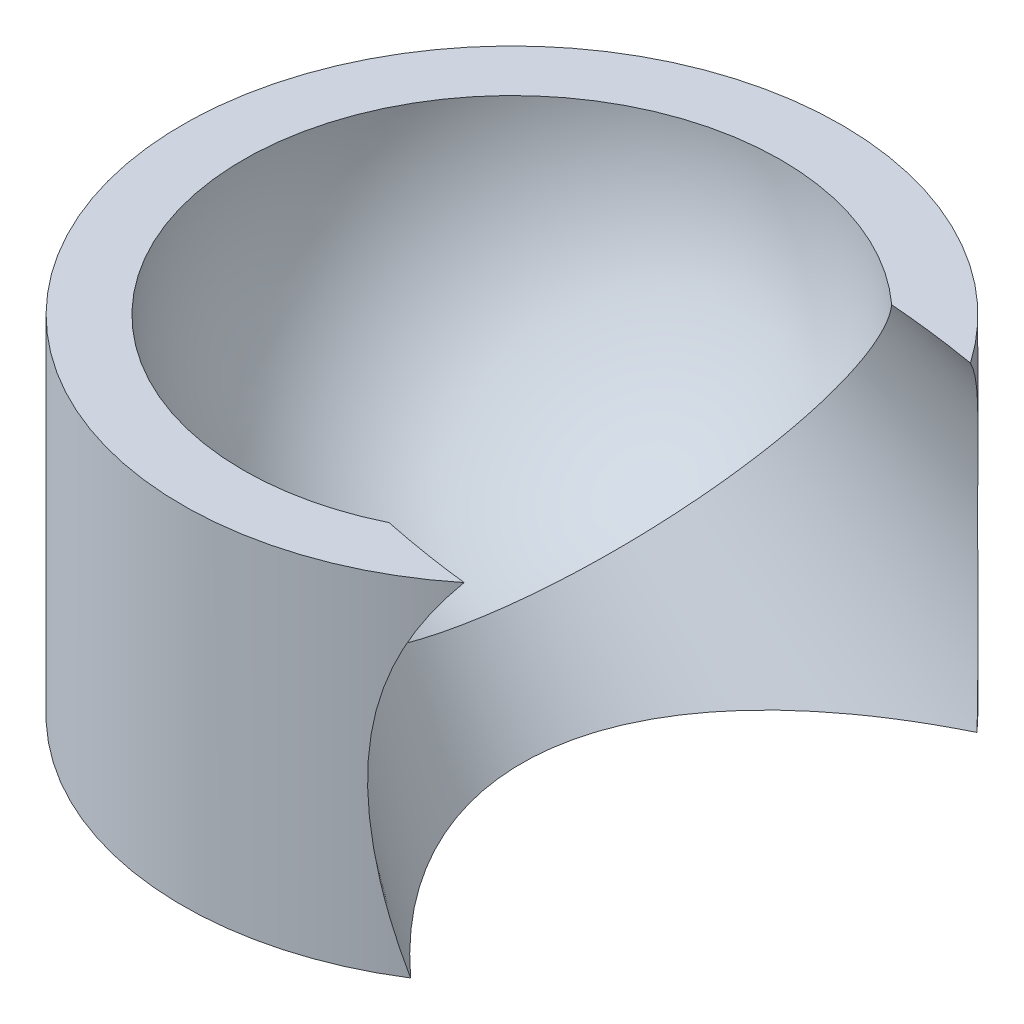
ISO-10303-21;
HEADER;
FILE_DESCRIPTION(('STEP AP214'),'2;1');
FILE_NAME('part.step','',(''),(''),'','','');
FILE_SCHEMA(('AUTOMOTIVE_DESIGN { 1 0 10303 214 1 1 1 1 }'));
ENDSEC;
DATA;
#1=APPLICATION_CONTEXT('core data for automotive mechanical design processes');
#2=APPLICATION_PROTOCOL_DEFINITION('international standard','automotive_design',2000,#1);
#3=PRODUCT_CONTEXT('',#1,'mechanical');
#4=PRODUCT('Part','Part','',(#3));
#5=PRODUCT_RELATED_PRODUCT_CATEGORY('part','',(#4));
#6=PRODUCT_DEFINITION_FORMATION('','',#4);
#7=PRODUCT_DEFINITION_CONTEXT('part definition',#1,'design');
#8=PRODUCT_DEFINITION('design','',#6,#7);
#9=PRODUCT_DEFINITION_SHAPE('','',#8);
#10=(LENGTH_UNIT() NAMED_UNIT(*) SI_UNIT(.MILLI.,.METRE.));
#11=(NAMED_UNIT(*) PLANE_ANGLE_UNIT() SI_UNIT($,.RADIAN.));
#12=(NAMED_UNIT(*) SI_UNIT($,.STERADIAN.) SOLID_ANGLE_UNIT());
#13=UNCERTAINTY_MEASURE_WITH_UNIT(LENGTH_MEASURE(1.E-05),#10,'distance_accuracy_value','');
#14=(GEOMETRIC_REPRESENTATION_CONTEXT(3) GLOBAL_UNCERTAINTY_ASSIGNED_CONTEXT((#13)) GLOBAL_UNIT_ASSIGNED_CONTEXT((#10,
#11,#12)) REPRESENTATION_CONTEXT('',''));
#15=CARTESIAN_POINT('',(0.,0.,0.));
#16=DIRECTION('',(0.,0.,1.));
#17=DIRECTION('',(1.,0.,0.));
#18=AXIS2_PLACEMENT_3D('',#15,#16,#17);
#19=CARTESIAN_POINT('',(-82.2724133595217,97.7,-15.));
#20=DIRECTION('',(0.,-1.,0.));
#21=DIRECTION('',(0.,0.,1.));
#22=AXIS2_PLACEMENT_3D('',#19,#20,#21);
#23=CYLINDRICAL_SURFACE('',#22,3.8);
#24=CARTESIAN_POINT('',(-82.2724133595217,97.,-15.));
#25=DIRECTION('',(0.,-1.,0.));
#26=DIRECTION('',(0.,0.,-1.));
#27=AXIS2_PLACEMENT_3D('',#24,#25,#26);
#28=CIRCLE('',#27,3.8);
#29=CARTESIAN_POINT('',(-80.2346484142775,97.,-11.7925845252081));
#30=VERTEX_POINT('',#29);
#31=CARTESIAN_POINT('',(-79.4208360761548,97.,-17.5116741422777));
#32=VERTEX_POINT('',#31);
#33=EDGE_CURVE('E47',#30,#32,#28,.T.);
#34=ORIENTED_EDGE('',*,*,#33,.F.);
#35=CARTESIAN_POINT('',(-79.8757515721661,101.0002,-12.0510998190801));
#36=CARTESIAN_POINT('',(-79.9187324942041,100.941314470494,-12.0161596661977));
#37=CARTESIAN_POINT('',(-79.9607737867758,100.880334472737,-11.9835604754787));
#38=CARTESIAN_POINT('',(-80.0421203511133,100.754374278326,-11.9229308128146));
#39=CARTESIAN_POINT('',(-80.0814246426146,100.689392664025,-11.8949019729807));
#40=CARTESIAN_POINT('',(-80.1561944542201,100.556042110918,-11.8434718400634));
#41=CARTESIAN_POINT('',(-80.1916806155117,100.487694636403,-11.8200450333706));
#42=CARTESIAN_POINT('',(-80.2582872747055,100.347645833791,-11.7774452092828));
#43=CARTESIAN_POINT('',(-80.2894086838969,100.275945209957,-11.7582713034635));
#44=CARTESIAN_POINT('',(-80.3467645054102,100.129422236479,-11.723874171494));
#45=CARTESIAN_POINT('',(-80.3729830658612,100.054590686642,-11.708663699603));
#46=CARTESIAN_POINT('',(-80.420020103535,99.9025749564758,-11.6819626490187));
#47=CARTESIAN_POINT('',(-80.4408364300622,99.8253898527917,-11.6704735513997));
#48=CARTESIAN_POINT('',(-80.4769106153219,99.6693551529714,-11.6508818974913));
#49=CARTESIAN_POINT('',(-80.4921709705092,99.5905063212864,-11.642777819975));
#50=CARTESIAN_POINT('',(-80.5172652372034,99.4316928256814,-11.629591546817));
#51=CARTESIAN_POINT('',(-80.5270975251341,99.3517278352348,-11.6245102552784));
#52=CARTESIAN_POINT('',(-80.5447869030997,99.1563821489884,-11.6154089956451));
#53=CARTESIAN_POINT('',(-80.5499364918525,99.0406874090679,-11.6128058459412));
#54=CARTESIAN_POINT('',(-80.551001814994,98.8092431130935,-11.6122673948075));
#55=CARTESIAN_POINT('',(-80.5469121531169,98.6934935645023,-11.6143348212687));
#56=CARTESIAN_POINT('',(-80.5309163732629,98.4621048722978,-11.6225354664216));
#57=CARTESIAN_POINT('',(-80.5189696358879,98.3464694469416,-11.6286898152432));
#58=CARTESIAN_POINT('',(-80.4885971699469,98.1163673648676,-11.6446622588753));
#59=CARTESIAN_POINT('',(-80.4701728966108,98.001900451573,-11.6544795308113));
#60=CARTESIAN_POINT('',(-80.4210621704128,97.7367003729433,-11.6813378193191));
#61=CARTESIAN_POINT('',(-80.3883355698651,97.5864778116716,-11.6996938161132));
#62=CARTESIAN_POINT('',(-80.3340717268447,97.3639688517672,-11.7314735876289));
#63=CARTESIAN_POINT('',(-80.3152421185966,97.2906762454686,-11.7426993300624));
#64=CARTESIAN_POINT('',(-80.2760307382489,97.14474722216,-11.7665833087369));
#65=CARTESIAN_POINT('',(-80.2556490695164,97.0721107618106,-11.7792414496075));
#66=CARTESIAN_POINT('',(-80.234590161155,96.9998,-11.7926215358648));
#67=B_SPLINE_CURVE_WITH_KNOTS('',3,(#35,#36,#37,#38,#39,#40,#41,#42,#43,#44,#45,#46,#47,#48,#49,
#50,#51,#52,#53,#54,#55,#56,#57,#58,#59,#60,#61,#62,#63,#64,#65,#66),.UNSPECIFIED.,.F.,.F.,(4,2,
2,2,2,2,2,2,2,2,2,2,2,2,2,4),(0.,0.242487812446085,0.485062030598379,0.726250914982063,
0.967389367841493,1.20929447541562,1.45129574114893,1.69318813428322,1.93515284012404,
2.28209096716265,2.62923177885385,2.97818149210642,3.32705286107755,3.79116730720974,
4.020646080706,4.25010958426819),.UNSPECIFIED.);
#68=CARTESIAN_POINT('',(-79.8758974920685,101.,-12.0509812314864));
#69=VERTEX_POINT('',#68);
#70=EDGE_CURVE('E100',#69,#30,#67,.T.);
#71=ORIENTED_EDGE('',*,*,#70,.F.);
#72=CARTESIAN_POINT('',(-82.2724133595217,101.,-15.));
#73=DIRECTION('',(0.,-1.,0.));
#74=DIRECTION('',(0.,0.,-1.));
#75=AXIS2_PLACEMENT_3D('',#72,#73,#74);
#76=CIRCLE('',#75,3.8);
#77=CARTESIAN_POINT('',(-79.1484041425032,101.,-17.1634616733336));
#78=VERTEX_POINT('',#77);
#79=EDGE_CURVE('E84',#69,#78,#76,.T.);
#80=ORIENTED_EDGE('',*,*,#79,.T.);
#81=CARTESIAN_POINT('',(-79.4207904593027,96.9998,-17.51162235118));
#82=CARTESIAN_POINT('',(-79.4369262194832,97.0705546747354,-17.529942716842));
#83=CARTESIAN_POINT('',(-79.4526325529312,97.1416227927385,-17.5474188700959));
#84=CARTESIAN_POINT('',(-79.4830068820868,97.2843968994103,-17.5806429487578));
#85=CARTESIAN_POINT('',(-79.4976746731815,97.3561030106608,-17.596390533939));
#86=CARTESIAN_POINT('',(-79.5399510327827,97.5727136817751,-17.641086102033));
#87=CARTESIAN_POINT('',(-79.5657040388626,97.7185595063866,-17.6673434890366));
#88=CARTESIAN_POINT('',(-79.6109327630899,98.0158920594204,-17.7124834219657));
#89=CARTESIAN_POINT('',(-79.6302505518494,98.1674313864205,-17.731182538714));
#90=CARTESIAN_POINT('',(-79.6592635940215,98.4721704684842,-17.7589622394461));
#91=CARTESIAN_POINT('',(-79.6689752628782,98.6253669371333,-17.7680592338353));
#92=CARTESIAN_POINT('',(-79.6744706398831,98.8659999089151,-17.7732094047869));
#93=CARTESIAN_POINT('',(-79.6744580705941,98.9532633070037,-17.7731991134858));
#94=CARTESIAN_POINT('',(-79.6699237880866,99.1275942839114,-17.768946072486));
#95=CARTESIAN_POINT('',(-79.6654019533468,99.2146618573899,-17.7647032087227));
#96=CARTESIAN_POINT('',(-79.6514849354616,99.3874862827804,-17.751513350895));
#97=CARTESIAN_POINT('',(-79.6421218637592,99.473247984399,-17.742597348031));
#98=CARTESIAN_POINT('',(-79.6183236497529,99.6433678720104,-17.7195739487868));
#99=CARTESIAN_POINT('',(-79.6038889305033,99.727726174454,-17.7054669854088));
#100=CARTESIAN_POINT('',(-79.5698058726259,99.8952399752276,-17.671422636116));
#101=CARTESIAN_POINT('',(-79.5500998326725,99.9783707074235,-17.6514204565739));
#102=CARTESIAN_POINT('',(-79.5059406509832,100.141642311545,-17.6053110062388));
#103=CARTESIAN_POINT('',(-79.4814868573308,100.22178277107,-17.5792028969366));
#104=CARTESIAN_POINT('',(-79.4285226937757,100.378437216735,-17.5206829331851));
#105=CARTESIAN_POINT('',(-79.4000080208012,100.454947239775,-17.4882643783919));
#106=CARTESIAN_POINT('',(-79.3399114430989,100.603678553575,-17.4171460803157));
#107=CARTESIAN_POINT('',(-79.3083309961023,100.675901856538,-17.3784493164117));
#108=CARTESIAN_POINT('',(-79.2550966273551,100.790159616009,-17.3101794474463));
#109=CARTESIAN_POINT('',(-79.2340328268013,100.83358075225,-17.2824403200197));
#110=CARTESIAN_POINT('',(-79.1914504990428,100.918387540099,-17.2246248482954));
#111=CARTESIAN_POINT('',(-79.1699334919482,100.959778804244,-17.1945556201363));
#112=CARTESIAN_POINT('',(-79.1482970942916,101.0002,-17.1633070890017));
#113=B_SPLINE_CURVE_WITH_KNOTS('',3,(#81,#82,#83,#84,#85,#86,#87,#88,#89,#90,#91,#92,#93,#94,
#95,#96,#97,#98,#99,#100,#101,#102,#103,#104,#105,#106,#107,#108,#109,#110,#111,#112),
.UNSPECIFIED.,.F.,.F.,(4,2,2,2,2,2,2,2,2,2,2,2,2,2,2,4),(0.,0.224529608607498,0.449103331512397,
0.899999438098988,1.36126182999427,1.82173462355418,2.08334352968169,2.34495948616088,
2.60486201655752,2.86474287218569,3.1275939253799,3.39048109634728,3.65364893503415,
3.91669224847528,4.08360469898818,4.25002609611645),.UNSPECIFIED.);
#114=EDGE_CURVE('E78',#32,#78,#113,.T.);
#115=ORIENTED_EDGE('',*,*,#114,.F.);
#116=EDGE_LOOP('',(#34,#71,#80,#115));
#117=FACE_BOUND('',#116,.T.);
#118=ADVANCED_FACE('F41',(#117),#23,.T.);
#119=CARTESIAN_POINT('',(-82.2724133595217,97.,-15.));
#120=DIRECTION('',(0.,1.,0.));
#121=DIRECTION('',(0.,0.,-1.));
#122=AXIS2_PLACEMENT_3D('',#119,#120,#121);
#123=PLANE('',#122);
#124=ORIENTED_EDGE('',*,*,#33,.T.);
#125=CARTESIAN_POINT('',(-71.3162534697557,97.,-13.4409654868627));
#126=DIRECTION('',(0.,-1.,0.));
#127=DIRECTION('',(0.990026908932881,0.,0.140878385811327));
#128=AXIS2_PLACEMENT_3D('',#125,#126,#127);
#129=ELLIPSE('',#128,10.5033012386468,5.02786274995613);
#130=EDGE_CURVE('E62',#30,#32,#129,.T.);
#131=ORIENTED_EDGE('',*,*,#130,.F.);
#132=EDGE_LOOP('',(#124,#131));
#133=FACE_BOUND('',#132,.T.);
#134=ADVANCED_FACE('F108',(#133),#123,.F.);
#135=CARTESIAN_POINT('',(-82.2724133595217,101.,-15.));
#136=DIRECTION('',(0.,1.,0.));
#137=DIRECTION('',(0.,0.,-1.));
#138=AXIS2_PLACEMENT_3D('',#135,#136,#137);
#139=PLANE('',#138);
#140=CARTESIAN_POINT('',(-79.8256121020381,101.,-14.6518262196257));
#141=DIRECTION('',(0.,-1.,0.));
#142=DIRECTION('',(0.990026908932881,0.,0.140878385811327));
#143=AXIS2_PLACEMENT_3D('',#140,#141,#142);
#144=ELLIPSE('',#143,5.40311255334571,2.58643522865266);
#145=CARTESIAN_POINT('',(-80.9068417887553,101.,-12.2169774910873));
#146=VERTEX_POINT('',#145);
#147=EDGE_CURVE('E85',#69,#146,#144,.T.);
#148=ORIENTED_EDGE('',*,*,#147,.T.);
#149=CARTESIAN_POINT('',(-82.2724133595217,101.,-15.));
#150=DIRECTION('',(0.,-1.,0.));
#151=DIRECTION('',(0.,0.,-1.));
#152=AXIS2_PLACEMENT_3D('',#149,#150,#151);
#153=CIRCLE('',#152,3.1);
#154=CARTESIAN_POINT('',(-80.1847308375046,101.,-17.2916329739433));
#155=VERTEX_POINT('',#154);
#156=EDGE_CURVE('E74',#146,#155,#153,.T.);
#157=ORIENTED_EDGE('',*,*,#156,.T.);
#158=EDGE_CURVE('E77',#155,#78,#144,.T.);
#159=ORIENTED_EDGE('',*,*,#158,.T.);
#160=ORIENTED_EDGE('',*,*,#79,.F.);
#161=EDGE_LOOP('',(#148,#157,#159,#160));
#162=FACE_BOUND('',#161,.T.);
#163=ADVANCED_FACE('F83',(#162),#139,.T.);
#164=CARTESIAN_POINT('',(-82.2724133595217,101.,-15.));
#165=DIRECTION('',(0.,0.,-1.));
#166=DIRECTION('',(-1.,0.,0.));
#167=AXIS2_PLACEMENT_3D('',#164,#165,#166);
#168=SPHERICAL_SURFACE('',#167,3.1);
#169=ORIENTED_EDGE('',*,*,#156,.F.);
#170=CARTESIAN_POINT('',(-81.0461217534082,100.208810505388,-14.8255017308676));
#171=DIRECTION('',(0.834342962059054,-0.538308656109163,0.118724944390263));
#172=DIRECTION('',(0.542143136161945,0.840286153588461,0.));
#173=AXIS2_PLACEMENT_3D('',#170,#171,#172);
#174=CIRCLE('',#173,2.72942822482297);
#175=EDGE_CURVE('E11',#155,#146,#174,.F.);
#176=ORIENTED_EDGE('',*,*,#175,.F.);
#177=EDGE_LOOP('',(#169,#176));
#178=FACE_BOUND('',#177,.T.);
#179=ADVANCED_FACE('F75',(#178),#168,.F.);
#180=CARTESIAN_POINT('',(-82.2724133595217,101.,-15.));
#181=DIRECTION('',(0.834342962059054,-0.538308656109163,0.118724944390263));
#182=DIRECTION('',(-0.542143136161945,-0.840286153588461,0.));
#183=AXIS2_PLACEMENT_3D('',#180,#181,#182);
#184=CONICAL_SURFACE('',#183,2.3,0.284261523704203);
#185=ORIENTED_EDGE('',*,*,#70,.T.);
#186=ORIENTED_EDGE('',*,*,#130,.T.);
#187=ORIENTED_EDGE('',*,*,#114,.T.);
#188=ORIENTED_EDGE('',*,*,#158,.F.);
#189=ORIENTED_EDGE('',*,*,#175,.T.);
#190=ORIENTED_EDGE('',*,*,#147,.F.);
#191=EDGE_LOOP('',(#185,#186,#187,#188,#189,#190));
#192=FACE_BOUND('',#191,.T.);
#193=ADVANCED_FACE('F80',(#192),#184,.F.);
#194=CLOSED_SHELL('',(#118,#134,#163,#179,#193));
#195=MANIFOLD_SOLID_BREP('B2',#194);
#196=ADVANCED_BREP_SHAPE_REPRESENTATION('',(#18,#195),#14);
#197=SHAPE_DEFINITION_REPRESENTATION(#9,#196);
ENDSEC;
END-ISO-10303-21;
